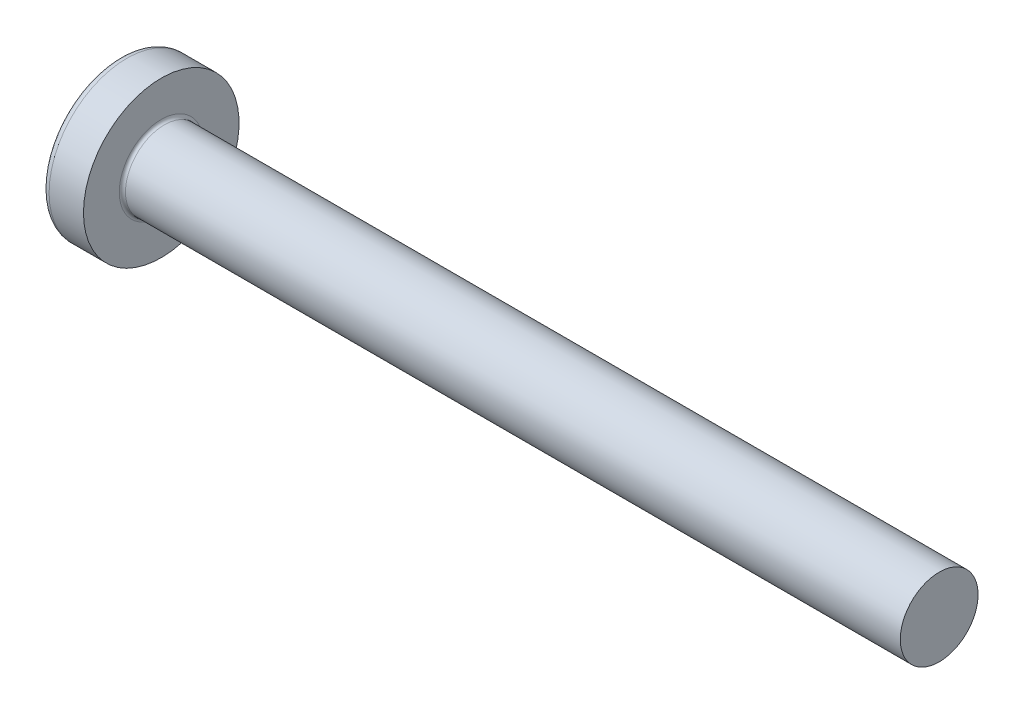
ISO-10303-21;
HEADER;
FILE_DESCRIPTION(('STEP AP214'),'2;1');
FILE_NAME('part.step','',(''),(''),'','','');
FILE_SCHEMA(('AUTOMOTIVE_DESIGN { 1 0 10303 214 1 1 1 1 }'));
ENDSEC;
DATA;
#1=APPLICATION_CONTEXT('core data for automotive mechanical design processes');
#2=APPLICATION_PROTOCOL_DEFINITION('international standard','automotive_design',2000,#1);
#3=PRODUCT_CONTEXT('',#1,'mechanical');
#4=PRODUCT('Part','Part','',(#3));
#5=PRODUCT_RELATED_PRODUCT_CATEGORY('part','',(#4));
#6=PRODUCT_DEFINITION_FORMATION('','',#4);
#7=PRODUCT_DEFINITION_CONTEXT('part definition',#1,'design');
#8=PRODUCT_DEFINITION('design','',#6,#7);
#9=PRODUCT_DEFINITION_SHAPE('','',#8);
#10=(LENGTH_UNIT() NAMED_UNIT(*) SI_UNIT(.MILLI.,.METRE.));
#11=(NAMED_UNIT(*) PLANE_ANGLE_UNIT() SI_UNIT($,.RADIAN.));
#12=(NAMED_UNIT(*) SI_UNIT($,.STERADIAN.) SOLID_ANGLE_UNIT());
#13=UNCERTAINTY_MEASURE_WITH_UNIT(LENGTH_MEASURE(1.E-05),#10,'distance_accuracy_value','');
#14=(GEOMETRIC_REPRESENTATION_CONTEXT(3) GLOBAL_UNCERTAINTY_ASSIGNED_CONTEXT((#13)) GLOBAL_UNIT_ASSIGNED_CONTEXT((#10,
#11,#12)) REPRESENTATION_CONTEXT('',''));
#15=CARTESIAN_POINT('',(0.,0.,0.));
#16=DIRECTION('',(0.,0.,1.));
#17=DIRECTION('',(1.,0.,0.));
#18=AXIS2_PLACEMENT_3D('',#15,#16,#17);
#19=CARTESIAN_POINT('',(4.,0.,0.));
#20=DIRECTION('',(-1.,0.,0.));
#21=DIRECTION('',(0.,1.,0.));
#22=AXIS2_PLACEMENT_3D('',#19,#20,#21);
#23=SPHERICAL_SURFACE('',#22,4.);
#24=CARTESIAN_POINT('',(0.803195914613468,0.,0.));
#25=DIRECTION('',(-1.,0.,0.));
#26=DIRECTION('',(0.,0.,1.));
#27=AXIS2_PLACEMENT_3D('',#24,#25,#26);
#28=CIRCLE('',#27,2.40425531914894);
#29=CARTESIAN_POINT('',(0.803195914613468,0.,2.40425531914894));
#30=VERTEX_POINT('',#29);
#31=EDGE_CURVE('E236',#30,#30,#28,.T.);
#32=ORIENTED_EDGE('',*,*,#31,.T.);
#33=EDGE_LOOP('',(#32));
#34=FACE_BOUND('',#33,.T.);
#35=CARTESIAN_POINT('',(0.0543400780062932,0.,0.));
#36=DIRECTION('',(1.,0.,0.));
#37=DIRECTION('',(0.,0.,-1.));
#38=AXIS2_PLACEMENT_3D('',#35,#36,#37);
#39=CIRCLE('',#38,0.657090389499513);
#40=CARTESIAN_POINT('',(0.0543400780062951,-0.369999999999997,-0.54301729251712));
#41=VERTEX_POINT('',#40);
#42=CARTESIAN_POINT('',(0.0543400780062932,-0.543017292517118,-0.37));
#43=VERTEX_POINT('',#42);
#44=EDGE_CURVE('E372',#41,#43,#39,.F.);
#45=ORIENTED_EDGE('',*,*,#44,.F.);
#46=CARTESIAN_POINT('',(4.,-0.37,0.));
#47=DIRECTION('',(0.,1.,0.));
#48=DIRECTION('',(0.,0.,1.));
#49=AXIS2_PLACEMENT_3D('',#46,#47,#48);
#50=CIRCLE('',#49,3.98285073785097);
#51=CARTESIAN_POINT('',(0.201999107564767,-0.369999999999995,-1.19928696360011));
#52=VERTEX_POINT('',#51);
#53=EDGE_CURVE('E298',#52,#41,#50,.T.);
#54=ORIENTED_EDGE('',*,*,#53,.F.);
#55=CARTESIAN_POINT('',(3.72274316107109,0.,0.55609120757213));
#56=DIRECTION('',(0.446197800778958,0.,-0.89493436774996));
#57=DIRECTION('',(-0.89493436774996,0.,-0.446197800778958));
#58=AXIS2_PLACEMENT_3D('',#55,#56,#57);
#59=CIRCLE('',#58,3.95144166275147);
#60=CARTESIAN_POINT('',(0.201999107564769,0.370000000000004,-1.19928696360011));
#61=VERTEX_POINT('',#60);
#62=EDGE_CURVE('E270',#52,#61,#59,.T.);
#63=ORIENTED_EDGE('',*,*,#62,.T.);
#64=CARTESIAN_POINT('',(4.,0.37,0.));
#65=DIRECTION('',(0.,-1.,0.));
#66=DIRECTION('',(0.,0.,-1.));
#67=AXIS2_PLACEMENT_3D('',#64,#65,#66);
#68=CIRCLE('',#67,3.98285073785097);
#69=CARTESIAN_POINT('',(0.0543400780062952,0.370000000000002,-0.543017292517118));
#70=VERTEX_POINT('',#69);
#71=EDGE_CURVE('E325',#70,#61,#68,.T.);
#72=ORIENTED_EDGE('',*,*,#71,.F.);
#73=CARTESIAN_POINT('',(0.0543400780062932,0.543017292517108,-0.37));
#74=VERTEX_POINT('',#73);
#75=EDGE_CURVE('E391',#74,#70,#39,.F.);
#76=ORIENTED_EDGE('',*,*,#75,.F.);
#77=CARTESIAN_POINT('',(4.,0.,-0.37));
#78=DIRECTION('',(0.,0.,1.));
#79=DIRECTION('',(0.,-1.,0.));
#80=AXIS2_PLACEMENT_3D('',#77,#78,#79);
#81=CIRCLE('',#80,3.98285073785097);
#82=CARTESIAN_POINT('',(0.201999107564769,1.19928696360011,-0.37));
#83=VERTEX_POINT('',#82);
#84=EDGE_CURVE('E264',#83,#74,#81,.T.);
#85=ORIENTED_EDGE('',*,*,#84,.F.);
#86=CARTESIAN_POINT('',(3.72274316107109,-0.556091207572132,0.));
#87=DIRECTION('',(0.446197800778958,0.89493436774996,0.));
#88=DIRECTION('',(-0.89493436774996,0.446197800778958,0.));
#89=AXIS2_PLACEMENT_3D('',#86,#87,#88);
#90=CIRCLE('',#89,3.95144166275147);
#91=CARTESIAN_POINT('',(0.201999107564769,1.19928696360011,0.369999999999999));
#92=VERTEX_POINT('',#91);
#93=EDGE_CURVE('E267',#83,#92,#90,.T.);
#94=ORIENTED_EDGE('',*,*,#93,.T.);
#95=CARTESIAN_POINT('',(4.,0.,0.37));
#96=DIRECTION('',(0.,0.,-1.));
#97=DIRECTION('',(0.,1.,0.));
#98=AXIS2_PLACEMENT_3D('',#95,#96,#97);
#99=CIRCLE('',#98,3.98285073785097);
#100=CARTESIAN_POINT('',(0.0543400780062932,0.543017292517108,0.37));
#101=VERTEX_POINT('',#100);
#102=EDGE_CURVE('E260',#101,#92,#99,.T.);
#103=ORIENTED_EDGE('',*,*,#102,.F.);
#104=CARTESIAN_POINT('',(0.0543400780062959,0.369999999999998,0.54301729251712));
#105=VERTEX_POINT('',#104);
#106=EDGE_CURVE('E390',#105,#101,#39,.F.);
#107=ORIENTED_EDGE('',*,*,#106,.F.);
#108=CARTESIAN_POINT('',(0.201999107564769,0.369999999999996,1.19928696360011));
#109=VERTEX_POINT('',#108);
#110=EDGE_CURVE('E280',#109,#105,#68,.T.);
#111=ORIENTED_EDGE('',*,*,#110,.F.);
#112=CARTESIAN_POINT('',(3.72274316107109,0.,-0.556091207572131));
#113=DIRECTION('',(0.446197800778958,0.,0.89493436774996));
#114=DIRECTION('',(0.89493436774996,0.,-0.446197800778958));
#115=AXIS2_PLACEMENT_3D('',#112,#113,#114);
#116=CIRCLE('',#115,3.95144166275147);
#117=CARTESIAN_POINT('',(0.201999107564767,-0.370000000000003,1.19928696360011));
#118=VERTEX_POINT('',#117);
#119=EDGE_CURVE('E47',#109,#118,#116,.T.);
#120=ORIENTED_EDGE('',*,*,#119,.T.);
#121=CARTESIAN_POINT('',(0.0543400780062943,-0.370000000000002,0.543017292517118));
#122=VERTEX_POINT('',#121);
#123=EDGE_CURVE('E277',#122,#118,#50,.T.);
#124=ORIENTED_EDGE('',*,*,#123,.F.);
#125=CARTESIAN_POINT('',(0.0543400780062932,-0.543017292517119,0.369999999999999));
#126=VERTEX_POINT('',#125);
#127=EDGE_CURVE('E426',#126,#122,#39,.F.);
#128=ORIENTED_EDGE('',*,*,#127,.F.);
#129=CARTESIAN_POINT('',(0.201999107564767,-1.19928696360011,0.369999999999999));
#130=VERTEX_POINT('',#129);
#131=EDGE_CURVE('E261',#130,#126,#99,.T.);
#132=ORIENTED_EDGE('',*,*,#131,.F.);
#133=CARTESIAN_POINT('',(3.72274316107108,0.556091207572129,0.));
#134=DIRECTION('',(0.446197800778958,-0.89493436774996,0.));
#135=DIRECTION('',(0.89493436774996,0.446197800778958,0.));
#136=AXIS2_PLACEMENT_3D('',#133,#134,#135);
#137=CIRCLE('',#136,3.95144166275147);
#138=CARTESIAN_POINT('',(0.201999107564767,-1.19928696360011,-0.37));
#139=VERTEX_POINT('',#138);
#140=EDGE_CURVE('E257',#130,#139,#137,.T.);
#141=ORIENTED_EDGE('',*,*,#140,.T.);
#142=EDGE_CURVE('E62',#43,#139,#81,.T.);
#143=ORIENTED_EDGE('',*,*,#142,.F.);
#144=EDGE_LOOP('',(#45,#54,#63,#72,#76,#85,#94,#103,#107,#111,#120,#124,#128,#132,#141,#143));
#145=FACE_BOUND('',#144,.T.);
#146=ADVANCED_FACE('F34',(#34,#145),#23,.T.);
#147=CARTESIAN_POINT('',(1.5,0.552127613725262,-0.37));
#148=DIRECTION('',(0.,0.,1.));
#149=DIRECTION('',(0.,-1.,0.));
#150=AXIS2_PLACEMENT_3D('',#147,#148,#149);
#151=PLANE('',#150);
#152=ORIENTED_EDGE('',*,*,#84,.T.);
#153=CARTESIAN_POINT('',(-0.984107487670367,0.628943903400079,-0.37));
#154=CARTESIAN_POINT('',(-0.783603343010497,0.61266994729586,-0.37));
#155=CARTESIAN_POINT('',(-0.583110931105435,0.596248129681252,-0.37));
#156=CARTESIAN_POINT('',(-0.18215578845311,0.562989164841799,-0.37));
#157=CARTESIAN_POINT('',(0.0183069414727265,0.546152007726099,-0.37));
#158=CARTESIAN_POINT('',(0.419186928470242,0.511943523152269,-0.37));
#159=CARTESIAN_POINT('',(0.619604185545593,0.494572195737286,-0.37));
#160=CARTESIAN_POINT('',(1.02037173794803,0.459102589125813,-0.37));
#161=CARTESIAN_POINT('',(1.2207220342401,0.441004320904832,-0.37));
#162=CARTESIAN_POINT('',(1.53631168775438,0.411665443099097,-0.37));
#163=CARTESIAN_POINT('',(1.65158348734389,0.400774467003668,-0.37));
#164=CARTESIAN_POINT('',(1.88208360561995,0.378547148307843,-0.37));
#165=CARTESIAN_POINT('',(1.99731192453001,0.367210808029148,-0.37));
#166=CARTESIAN_POINT('',(2.22771614129417,0.343963614894539,-0.37));
#167=CARTESIAN_POINT('',(2.34289203669258,0.332052737461204,-0.37));
#168=CARTESIAN_POINT('',(2.57315819348689,0.307413208767174,-0.37));
#169=CARTESIAN_POINT('',(2.68824845325201,0.294684542317003,-0.37));
#170=CARTESIAN_POINT('',(2.80327961663977,0.281425340988347,-0.37));
#171=B_SPLINE_CURVE_WITH_KNOTS('',3,(#153,#154,#155,#156,#157,#158,#159,#160,#161,#162,#163,
#164,#165,#166,#167,#168,#169,#170),.UNSPECIFIED.,.F.,.F.,(4,2,2,2,2,2,2,2,4),(0.,
0.603490856265592,1.20699609790448,1.81050129079485,2.41399737525605,2.76135214324501,
3.1087051006998,3.45607293034176,3.80344721380205),.UNSPECIFIED.);
#172=CARTESIAN_POINT('',(1.5,0.415013252800437,-0.370000000000001));
#173=VERTEX_POINT('',#172);
#174=EDGE_CURVE('E412',#74,#173,#171,.T.);
#175=ORIENTED_EDGE('',*,*,#174,.T.);
#176=DIRECTION('',(0.,1.,0.));
#177=VECTOR('',#176,1.);
#178=CARTESIAN_POINT('',(1.5,-0.552127613725262,-0.37));
#179=LINE('',#178,#177);
#180=CARTESIAN_POINT('',(1.5,0.552127613725262,-0.37));
#181=VERTEX_POINT('',#180);
#182=EDGE_CURVE('E354',#173,#181,#179,.T.);
#183=ORIENTED_EDGE('',*,*,#182,.T.);
#184=DIRECTION('',(0.89493436774996,-0.446197800778958,0.));
#185=VECTOR('',#184,1.);
#186=CARTESIAN_POINT('',(0.,1.3,-0.37));
#187=LINE('',#186,#185);
#188=EDGE_CURVE('E237',#83,#181,#187,.T.);
#189=ORIENTED_EDGE('',*,*,#188,.F.);
#190=EDGE_LOOP('',(#152,#175,#183,#189));
#191=FACE_BOUND('',#190,.T.);
#192=ADVANCED_FACE('F192',(#191),#151,.T.);
#193=CARTESIAN_POINT('',(1.5,-0.552127613725262,-0.37));
#194=VERTEX_POINT('',#193);
#195=CARTESIAN_POINT('',(1.5,-0.415013252800437,-0.370000000000001));
#196=VERTEX_POINT('',#195);
#197=EDGE_CURVE('E245',#194,#196,#179,.T.);
#198=ORIENTED_EDGE('',*,*,#197,.T.);
#199=CARTESIAN_POINT('',(-0.984107487670368,-0.62894390340008,-0.37));
#200=CARTESIAN_POINT('',(-0.783603343010498,-0.61266994729586,-0.37));
#201=CARTESIAN_POINT('',(-0.583110931105436,-0.596248129681252,-0.37));
#202=CARTESIAN_POINT('',(-0.18215578845311,-0.562989164841799,-0.37));
#203=CARTESIAN_POINT('',(0.0183069414727262,-0.546152007726099,-0.37));
#204=CARTESIAN_POINT('',(0.419186928470242,-0.511943523152269,-0.37));
#205=CARTESIAN_POINT('',(0.619604185545593,-0.494572195737286,-0.37));
#206=CARTESIAN_POINT('',(1.02037173794803,-0.459102589125813,-0.37));
#207=CARTESIAN_POINT('',(1.22072203424009,-0.441004320904833,-0.37));
#208=CARTESIAN_POINT('',(1.53631168775438,-0.411665443099097,-0.37));
#209=CARTESIAN_POINT('',(1.65158348734389,-0.400774467003668,-0.37));
#210=CARTESIAN_POINT('',(1.88208360561995,-0.378547148307843,-0.37));
#211=CARTESIAN_POINT('',(1.99731192453001,-0.367210808029148,-0.37));
#212=CARTESIAN_POINT('',(2.22771614129417,-0.343963614894539,-0.37));
#213=CARTESIAN_POINT('',(2.34289203669258,-0.332052737461204,-0.37));
#214=CARTESIAN_POINT('',(2.57315819348689,-0.307413208767175,-0.37));
#215=CARTESIAN_POINT('',(2.68824845325202,-0.294684542317003,-0.37));
#216=CARTESIAN_POINT('',(2.80327961663977,-0.281425340988347,-0.37));
#217=B_SPLINE_CURVE_WITH_KNOTS('',3,(#199,#200,#201,#202,#203,#204,#205,#206,#207,#208,#209,
#210,#211,#212,#213,#214,#215,#216),.UNSPECIFIED.,.F.,.F.,(4,2,2,2,2,2,2,2,4),(0.,
0.603490856265593,1.20699609790448,1.81050129079485,2.41399737525605,2.76135214324501,
3.1087051006998,3.45607293034176,3.80344721380205),.UNSPECIFIED.);
#218=EDGE_CURVE('E389',#196,#43,#217,.F.);
#219=ORIENTED_EDGE('',*,*,#218,.T.);
#220=ORIENTED_EDGE('',*,*,#142,.T.);
#221=DIRECTION('',(0.89493436774996,0.446197800778958,0.));
#222=VECTOR('',#221,1.);
#223=CARTESIAN_POINT('',(0.,-1.3,-0.37));
#224=LINE('',#223,#222);
#225=EDGE_CURVE('E328',#139,#194,#224,.T.);
#226=ORIENTED_EDGE('',*,*,#225,.T.);
#227=EDGE_LOOP('',(#198,#219,#220,#226));
#228=FACE_BOUND('',#227,.T.);
#229=ADVANCED_FACE('F198',(#228),#151,.T.);
#230=CARTESIAN_POINT('',(1.5,-0.552127613725262,0.369999999999999));
#231=DIRECTION('',(0.,0.,-1.));
#232=DIRECTION('',(0.,1.,0.));
#233=AXIS2_PLACEMENT_3D('',#230,#231,#232);
#234=PLANE('',#233);
#235=DIRECTION('',(0.,-1.,0.));
#236=VECTOR('',#235,1.);
#237=CARTESIAN_POINT('',(1.5,0.552127613725262,0.37));
#238=LINE('',#237,#236);
#239=CARTESIAN_POINT('',(1.5,0.552127613725262,0.37));
#240=VERTEX_POINT('',#239);
#241=CARTESIAN_POINT('',(1.5,0.415013252800437,0.370000000000001));
#242=VERTEX_POINT('',#241);
#243=EDGE_CURVE('E337',#240,#242,#238,.T.);
#244=ORIENTED_EDGE('',*,*,#243,.T.);
#245=CARTESIAN_POINT('',(-0.984107487670367,0.62894390340008,0.37));
#246=CARTESIAN_POINT('',(-0.783603343010497,0.61266994729586,0.37));
#247=CARTESIAN_POINT('',(-0.583110931105435,0.596248129681252,0.37));
#248=CARTESIAN_POINT('',(-0.182155788453109,0.562989164841799,0.37));
#249=CARTESIAN_POINT('',(0.0183069414727271,0.546152007726099,0.37));
#250=CARTESIAN_POINT('',(0.419186928470243,0.511943523152269,0.37));
#251=CARTESIAN_POINT('',(0.619604185545594,0.494572195737286,0.37));
#252=CARTESIAN_POINT('',(1.02037173794803,0.459102589125813,0.37));
#253=CARTESIAN_POINT('',(1.2207220342401,0.441004320904832,0.37));
#254=CARTESIAN_POINT('',(1.53631168775438,0.411665443099097,0.37));
#255=CARTESIAN_POINT('',(1.65158348734389,0.400774467003668,0.37));
#256=CARTESIAN_POINT('',(1.88208360561995,0.378547148307843,0.37));
#257=CARTESIAN_POINT('',(1.99731192453001,0.367210808029148,0.37));
#258=CARTESIAN_POINT('',(2.22771614129417,0.343963614894539,0.37));
#259=CARTESIAN_POINT('',(2.34289203669258,0.332052737461205,0.37));
#260=CARTESIAN_POINT('',(2.57315819348689,0.307413208767175,0.37));
#261=CARTESIAN_POINT('',(2.68824845325201,0.294684542317003,0.37));
#262=CARTESIAN_POINT('',(2.80327961663977,0.281425340988347,0.37));
#263=B_SPLINE_CURVE_WITH_KNOTS('',3,(#245,#246,#247,#248,#249,#250,#251,#252,#253,#254,#255,
#256,#257,#258,#259,#260,#261,#262),.UNSPECIFIED.,.F.,.F.,(4,2,2,2,2,2,2,2,4),(0.,
0.603490856265592,1.20699609790448,1.81050129079485,2.41399737525605,2.76135214324501,
3.1087051006998,3.45607293034176,3.80344721380205),.UNSPECIFIED.);
#264=EDGE_CURVE('E664',#242,#101,#263,.F.);
#265=ORIENTED_EDGE('',*,*,#264,.T.);
#266=ORIENTED_EDGE('',*,*,#102,.T.);
#267=DIRECTION('',(0.89493436774996,-0.446197800778958,0.));
#268=VECTOR('',#267,1.);
#269=CARTESIAN_POINT('',(0.,1.3,0.37));
#270=LINE('',#269,#268);
#271=EDGE_CURVE('E242',#92,#240,#270,.T.);
#272=ORIENTED_EDGE('',*,*,#271,.T.);
#273=EDGE_LOOP('',(#244,#265,#266,#272));
#274=FACE_BOUND('',#273,.T.);
#275=ADVANCED_FACE('F408',(#274),#234,.T.);
#276=ORIENTED_EDGE('',*,*,#131,.T.);
#277=CARTESIAN_POINT('',(-0.984107487670368,-0.62894390340008,0.369999999999999));
#278=CARTESIAN_POINT('',(-0.783603343010498,-0.612669947295861,0.369999999999999));
#279=CARTESIAN_POINT('',(-0.583110931105436,-0.596248129681252,0.369999999999999));
#280=CARTESIAN_POINT('',(-0.18215578845311,-0.562989164841799,0.369999999999999));
#281=CARTESIAN_POINT('',(0.0183069414727261,-0.5461520077261,0.369999999999999));
#282=CARTESIAN_POINT('',(0.419186928470242,-0.511943523152269,0.369999999999999));
#283=CARTESIAN_POINT('',(0.619604185545593,-0.494572195737287,0.369999999999999));
#284=CARTESIAN_POINT('',(1.02037173794803,-0.459102589125814,0.369999999999999));
#285=CARTESIAN_POINT('',(1.22072203424009,-0.441004320904833,0.369999999999999));
#286=CARTESIAN_POINT('',(1.53631168775438,-0.411665443099098,0.369999999999999));
#287=CARTESIAN_POINT('',(1.65158348734389,-0.400774467003669,0.37));
#288=CARTESIAN_POINT('',(1.88208360561995,-0.378547148307843,0.37));
#289=CARTESIAN_POINT('',(1.99731192453001,-0.367210808029148,0.37));
#290=CARTESIAN_POINT('',(2.22771614129417,-0.34396361489454,0.37));
#291=CARTESIAN_POINT('',(2.34289203669258,-0.332052737461205,0.37));
#292=CARTESIAN_POINT('',(2.57315819348689,-0.307413208767175,0.37));
#293=CARTESIAN_POINT('',(2.68824845325201,-0.294684542317003,0.37));
#294=CARTESIAN_POINT('',(2.80327961663977,-0.281425340988347,0.37));
#295=B_SPLINE_CURVE_WITH_KNOTS('',3,(#277,#278,#279,#280,#281,#282,#283,#284,#285,#286,#287,
#288,#289,#290,#291,#292,#293,#294),.UNSPECIFIED.,.F.,.F.,(4,2,2,2,2,2,2,2,4),(0.,
0.603490856265592,1.20699609790448,1.81050129079485,2.41399737525605,2.76135214324501,
3.1087051006998,3.45607293034176,3.80344721380205),.UNSPECIFIED.);
#296=CARTESIAN_POINT('',(1.5,-0.415013252800438,0.37));
#297=VERTEX_POINT('',#296);
#298=EDGE_CURVE('E427',#126,#297,#295,.T.);
#299=ORIENTED_EDGE('',*,*,#298,.T.);
#300=CARTESIAN_POINT('',(1.5,-0.552127613725262,0.369999999999999));
#301=VERTEX_POINT('',#300);
#302=EDGE_CURVE('E339',#297,#301,#238,.T.);
#303=ORIENTED_EDGE('',*,*,#302,.T.);
#304=DIRECTION('',(0.89493436774996,0.446197800778958,0.));
#305=VECTOR('',#304,1.);
#306=CARTESIAN_POINT('',(0.,-1.3,0.369999999999999));
#307=LINE('',#306,#305);
#308=EDGE_CURVE('E330',#130,#301,#307,.T.);
#309=ORIENTED_EDGE('',*,*,#308,.F.);
#310=EDGE_LOOP('',(#276,#299,#303,#309));
#311=FACE_BOUND('',#310,.T.);
#312=ADVANCED_FACE('F518',(#311),#234,.T.);
#313=CARTESIAN_POINT('',(1.5,0.552127613725262,0.37));
#314=DIRECTION('',(0.446197800778958,0.89493436774996,0.));
#315=DIRECTION('',(-0.89493436774996,0.446197800778958,0.));
#316=AXIS2_PLACEMENT_3D('',#313,#314,#315);
#317=PLANE('',#316);
#318=CARTESIAN_POINT('',(2.47007520981164,0.0684659723733949,0.));
#319=DIRECTION('',(0.446197800778958,0.89493436774996,0.));
#320=DIRECTION('',(-0.89493436774996,0.446197800778958,0.));
#321=AXIS2_PLACEMENT_3D('',#318,#319,#320);
#322=ELLIPSE('',#321,1.09405678911959,0.483340660124242);
#323=CARTESIAN_POINT('',(1.5,0.552127613725263,0.0655064741994778));
#324=VERTEX_POINT('',#323);
#325=CARTESIAN_POINT('',(1.5,0.552127613725263,-0.0655064741994778));
#326=VERTEX_POINT('',#325);
#327=EDGE_CURVE('E303',#324,#326,#322,.F.);
#328=ORIENTED_EDGE('',*,*,#327,.F.);
#329=DIRECTION('',(0.,0.,-1.));
#330=VECTOR('',#329,1.);
#331=CARTESIAN_POINT('',(1.5,0.552127613725262,0.37));
#332=LINE('',#331,#330);
#333=EDGE_CURVE('E340',#240,#324,#332,.T.);
#334=ORIENTED_EDGE('',*,*,#333,.F.);
#335=ORIENTED_EDGE('',*,*,#271,.F.);
#336=ORIENTED_EDGE('',*,*,#93,.F.);
#337=ORIENTED_EDGE('',*,*,#188,.T.);
#338=EDGE_CURVE('E342',#326,#181,#332,.T.);
#339=ORIENTED_EDGE('',*,*,#338,.F.);
#340=EDGE_LOOP('',(#328,#334,#335,#336,#337,#339));
#341=FACE_BOUND('',#340,.T.);
#342=ADVANCED_FACE('F406',(#341),#317,.F.);
#343=CARTESIAN_POINT('',(1.5,-0.552127613725262,-0.37));
#344=DIRECTION('',(0.446197800778958,-0.89493436774996,0.));
#345=DIRECTION('',(0.89493436774996,0.446197800778958,0.));
#346=AXIS2_PLACEMENT_3D('',#343,#344,#345);
#347=PLANE('',#346);
#348=CARTESIAN_POINT('',(2.47007520981164,-0.0684659723733946,0.));
#349=DIRECTION('',(0.446197800778958,-0.89493436774996,0.));
#350=DIRECTION('',(-0.89493436774996,-0.446197800778958,0.));
#351=AXIS2_PLACEMENT_3D('',#348,#349,#350);
#352=ELLIPSE('',#351,1.09405678911959,0.483340660124242);
#353=CARTESIAN_POINT('',(1.5,-0.552127613725263,-0.0655064741994742));
#354=VERTEX_POINT('',#353);
#355=CARTESIAN_POINT('',(1.5,-0.552127613725263,0.0655064741994742));
#356=VERTEX_POINT('',#355);
#357=EDGE_CURVE('E666',#354,#356,#352,.F.);
#358=ORIENTED_EDGE('',*,*,#357,.F.);
#359=DIRECTION('',(0.,0.,1.));
#360=VECTOR('',#359,1.);
#361=CARTESIAN_POINT('',(1.5,-0.552127613725262,-0.37));
#362=LINE('',#361,#360);
#363=EDGE_CURVE('E333',#194,#354,#362,.T.);
#364=ORIENTED_EDGE('',*,*,#363,.F.);
#365=ORIENTED_EDGE('',*,*,#225,.F.);
#366=ORIENTED_EDGE('',*,*,#140,.F.);
#367=ORIENTED_EDGE('',*,*,#308,.T.);
#368=EDGE_CURVE('E336',#356,#301,#362,.T.);
#369=ORIENTED_EDGE('',*,*,#368,.F.);
#370=EDGE_LOOP('',(#358,#364,#365,#366,#367,#369));
#371=FACE_BOUND('',#370,.T.);
#372=ADVANCED_FACE('F505',(#371),#347,.F.);
#373=CARTESIAN_POINT('',(1.5,0.552127613725262,-0.37));
#374=DIRECTION('',(-1.,0.,0.));
#375=DIRECTION('',(0.,0.,1.));
#376=AXIS2_PLACEMENT_3D('',#373,#374,#375);
#377=PLANE('',#376);
#378=DIRECTION('',(0.,1.,0.));
#379=VECTOR('',#378,1.);
#380=CARTESIAN_POINT('',(1.5,-0.370000000000002,0.552127613725261));
#381=LINE('',#380,#379);
#382=CARTESIAN_POINT('',(1.5,-0.370000000000002,0.552127613725261));
#383=VERTEX_POINT('',#382);
#384=CARTESIAN_POINT('',(1.5,-0.0655064741994869,0.552127613725262));
#385=VERTEX_POINT('',#384);
#386=EDGE_CURVE('E318',#383,#385,#381,.T.);
#387=ORIENTED_EDGE('',*,*,#386,.T.);
#388=CARTESIAN_POINT('',(1.5,0.,0.));
#389=DIRECTION('',(-1.,0.,0.));
#390=DIRECTION('',(0.,0.,1.));
#391=AXIS2_PLACEMENT_3D('',#388,#389,#390);
#392=CIRCLE('',#391,0.556);
#393=CARTESIAN_POINT('',(1.5,-0.370000000000001,0.415013252800437));
#394=VERTEX_POINT('',#393);
#395=EDGE_CURVE('E692',#394,#385,#392,.T.);
#396=ORIENTED_EDGE('',*,*,#395,.F.);
#397=DIRECTION('',(0.,0.,-1.));
#398=VECTOR('',#397,1.);
#399=CARTESIAN_POINT('',(1.5,-0.370000000000002,0.552127613725261));
#400=LINE('',#399,#398);
#401=EDGE_CURVE('E314',#383,#394,#400,.T.);
#402=ORIENTED_EDGE('',*,*,#401,.F.);
#403=EDGE_LOOP('',(#387,#396,#402));
#404=FACE_BOUND('',#403,.T.);
#405=ADVANCED_FACE('F462',(#404),#377,.T.);
#406=ORIENTED_EDGE('',*,*,#302,.F.);
#407=EDGE_CURVE('E697',#356,#297,#392,.T.);
#408=ORIENTED_EDGE('',*,*,#407,.F.);
#409=ORIENTED_EDGE('',*,*,#368,.T.);
#410=EDGE_LOOP('',(#406,#408,#409));
#411=FACE_BOUND('',#410,.T.);
#412=ADVANCED_FACE('F492',(#411),#377,.T.);
#413=ORIENTED_EDGE('',*,*,#363,.T.);
#414=EDGE_CURVE('E383',#196,#354,#392,.T.);
#415=ORIENTED_EDGE('',*,*,#414,.F.);
#416=ORIENTED_EDGE('',*,*,#197,.F.);
#417=EDGE_LOOP('',(#413,#415,#416));
#418=FACE_BOUND('',#417,.T.);
#419=ADVANCED_FACE('F486',(#418),#377,.T.);
#420=CARTESIAN_POINT('',(1.5,-0.369999999999998,-0.415013252800438));
#421=VERTEX_POINT('',#420);
#422=CARTESIAN_POINT('',(1.5,-0.369999999999997,-0.552127613725264));
#423=VERTEX_POINT('',#422);
#424=EDGE_CURVE('E317',#421,#423,#400,.T.);
#425=ORIENTED_EDGE('',*,*,#424,.F.);
#426=CARTESIAN_POINT('',(1.5,-0.0655064741994786,-0.552127613725263));
#427=VERTEX_POINT('',#426);
#428=EDGE_CURVE('E54',#427,#421,#392,.T.);
#429=ORIENTED_EDGE('',*,*,#428,.F.);
#430=DIRECTION('',(0.,-1.,0.));
#431=VECTOR('',#430,1.);
#432=CARTESIAN_POINT('',(1.5,0.370000000000002,-0.552127613725261));
#433=LINE('',#432,#431);
#434=EDGE_CURVE('E313',#427,#423,#433,.T.);
#435=ORIENTED_EDGE('',*,*,#434,.T.);
#436=EDGE_LOOP('',(#425,#429,#435));
#437=FACE_BOUND('',#436,.T.);
#438=ADVANCED_FACE('F378',(#437),#377,.T.);
#439=CARTESIAN_POINT('',(1.5,0.370000000000002,-0.552127613725261));
#440=VERTEX_POINT('',#439);
#441=CARTESIAN_POINT('',(1.5,0.0655064741994824,-0.552127613725262));
#442=VERTEX_POINT('',#441);
#443=EDGE_CURVE('E310',#440,#442,#433,.T.);
#444=ORIENTED_EDGE('',*,*,#443,.T.);
#445=CARTESIAN_POINT('',(1.5,0.370000000000001,-0.415013252800437));
#446=VERTEX_POINT('',#445);
#447=EDGE_CURVE('E382',#446,#442,#392,.T.);
#448=ORIENTED_EDGE('',*,*,#447,.F.);
#449=DIRECTION('',(0.,0.,1.));
#450=VECTOR('',#449,1.);
#451=CARTESIAN_POINT('',(1.5,0.370000000000002,-0.552127613725261));
#452=LINE('',#451,#450);
#453=EDGE_CURVE('E322',#440,#446,#452,.T.);
#454=ORIENTED_EDGE('',*,*,#453,.F.);
#455=EDGE_LOOP('',(#444,#448,#454));
#456=FACE_BOUND('',#455,.T.);
#457=ADVANCED_FACE('F474',(#456),#377,.T.);
#458=ORIENTED_EDGE('',*,*,#182,.F.);
#459=EDGE_CURVE('E681',#326,#173,#392,.T.);
#460=ORIENTED_EDGE('',*,*,#459,.F.);
#461=ORIENTED_EDGE('',*,*,#338,.T.);
#462=EDGE_LOOP('',(#458,#460,#461));
#463=FACE_BOUND('',#462,.T.);
#464=ADVANCED_FACE('F468',(#463),#377,.T.);
#465=ORIENTED_EDGE('',*,*,#333,.T.);
#466=EDGE_CURVE('E683',#242,#324,#392,.T.);
#467=ORIENTED_EDGE('',*,*,#466,.F.);
#468=ORIENTED_EDGE('',*,*,#243,.F.);
#469=EDGE_LOOP('',(#465,#467,#468));
#470=FACE_BOUND('',#469,.T.);
#471=ADVANCED_FACE('F460',(#470),#377,.T.);
#472=CARTESIAN_POINT('',(1.5,0.369999999999999,0.415013252800439));
#473=VERTEX_POINT('',#472);
#474=CARTESIAN_POINT('',(1.5,0.369999999999998,0.552127613725263));
#475=VERTEX_POINT('',#474);
#476=EDGE_CURVE('E295',#473,#475,#452,.T.);
#477=ORIENTED_EDGE('',*,*,#476,.F.);
#478=CARTESIAN_POINT('',(1.5,0.065506474199483,0.552127613725262));
#479=VERTEX_POINT('',#478);
#480=EDGE_CURVE('E384',#479,#473,#392,.T.);
#481=ORIENTED_EDGE('',*,*,#480,.F.);
#482=EDGE_CURVE('E321',#479,#475,#381,.T.);
#483=ORIENTED_EDGE('',*,*,#482,.T.);
#484=EDGE_LOOP('',(#477,#481,#483));
#485=FACE_BOUND('',#484,.T.);
#486=ADVANCED_FACE('F454',(#485),#377,.T.);
#487=CARTESIAN_POINT('',(1.5,0.369999999999998,0.552127613725263));
#488=DIRECTION('',(0.,-1.,0.));
#489=DIRECTION('',(0.,0.,-1.));
#490=AXIS2_PLACEMENT_3D('',#487,#488,#489);
#491=PLANE('',#490);
#492=ORIENTED_EDGE('',*,*,#110,.T.);
#493=CARTESIAN_POINT('',(-0.984107487668669,0.369999999999998,0.628943903399943));
#494=CARTESIAN_POINT('',(-0.783603343008974,0.369999999999998,0.612669947295737));
#495=CARTESIAN_POINT('',(-0.583110931104086,0.369999999999998,0.596248129681142));
#496=CARTESIAN_POINT('',(-0.182155788452108,0.369999999999998,0.562989164841716));
#497=CARTESIAN_POINT('',(0.0183069414735535,0.369999999999998,0.546152007726031));
#498=CARTESIAN_POINT('',(0.419186928470486,0.369999999999998,0.511943523152249));
#499=CARTESIAN_POINT('',(0.61960418554543,0.369999999999998,0.494572195737301));
#500=CARTESIAN_POINT('',(1.02037173794706,0.369999999999998,0.459102589125902));
#501=CARTESIAN_POINT('',(1.22072203423871,0.369999999999999,0.441004320904959));
#502=CARTESIAN_POINT('',(1.53631168775258,0.369999999999999,0.411665443099267));
#503=CARTESIAN_POINT('',(1.65158348734209,0.369999999999999,0.40077446700384));
#504=CARTESIAN_POINT('',(1.88208360561816,0.369999999999999,0.378547148308019));
#505=CARTESIAN_POINT('',(1.99731192452822,0.369999999999999,0.367210808029327));
#506=CARTESIAN_POINT('',(2.22771614129237,0.369999999999999,0.343963614894724));
#507=CARTESIAN_POINT('',(2.34289203669079,0.369999999999999,0.332052737461393));
#508=CARTESIAN_POINT('',(2.5731581934851,0.369999999999999,0.307413208767371));
#509=CARTESIAN_POINT('',(2.68824845325022,0.369999999999999,0.294684542317205));
#510=CARTESIAN_POINT('',(2.80327961663798,0.369999999999999,0.281425340988555));
#511=B_SPLINE_CURVE_WITH_KNOTS('',3,(#493,#494,#495,#496,#497,#498,#499,#500,#501,#502,#503,
#504,#505,#506,#507,#508,#509,#510),.UNSPECIFIED.,.F.,.F.,(4,2,2,2,2,2,2,2,4),(0.,
0.603490856265068,1.20699609790343,1.81050129079257,2.41399737525255,2.7613521432415,
3.1087051006963,3.45607293033825,3.80344721379854),.UNSPECIFIED.);
#512=EDGE_CURVE('E663',#105,#473,#511,.T.);
#513=ORIENTED_EDGE('',*,*,#512,.T.);
#514=ORIENTED_EDGE('',*,*,#476,.T.);
#515=DIRECTION('',(0.89493436774996,0.,-0.446197800778958));
#516=VECTOR('',#515,1.);
#517=CARTESIAN_POINT('',(0.,0.369999999999996,1.3));
#518=LINE('',#517,#516);
#519=EDGE_CURVE('E288',#109,#475,#518,.T.);
#520=ORIENTED_EDGE('',*,*,#519,.F.);
#521=EDGE_LOOP('',(#492,#513,#514,#520));
#522=FACE_BOUND('',#521,.T.);
#523=ADVANCED_FACE('F292',(#522),#491,.T.);
#524=CARTESIAN_POINT('',(1.5,-0.369999999999997,-0.552127613725264));
#525=DIRECTION('',(0.,1.,0.));
#526=DIRECTION('',(0.,0.,1.));
#527=AXIS2_PLACEMENT_3D('',#524,#525,#526);
#528=PLANE('',#527);
#529=ORIENTED_EDGE('',*,*,#401,.T.);
#530=CARTESIAN_POINT('',(-0.984107487668671,-0.370000000000002,0.628943903399941));
#531=CARTESIAN_POINT('',(-0.783603343008975,-0.370000000000002,0.612669947295735));
#532=CARTESIAN_POINT('',(-0.583110931104087,-0.370000000000002,0.59624812968114));
#533=CARTESIAN_POINT('',(-0.18215578845211,-0.370000000000002,0.562989164841714));
#534=CARTESIAN_POINT('',(0.0183069414735518,-0.370000000000002,0.546152007726028));
#535=CARTESIAN_POINT('',(0.419186928470486,-0.370000000000001,0.511943523152246));
#536=CARTESIAN_POINT('',(0.619604185545429,-0.370000000000001,0.494572195737299));
#537=CARTESIAN_POINT('',(1.02037173794706,-0.370000000000001,0.459102589125899));
#538=CARTESIAN_POINT('',(1.22072203423871,-0.370000000000001,0.441004320904957));
#539=CARTESIAN_POINT('',(1.53631168775258,-0.370000000000001,0.411665443099265));
#540=CARTESIAN_POINT('',(1.65158348734209,-0.370000000000001,0.400774467003838));
#541=CARTESIAN_POINT('',(1.88208360561815,-0.370000000000001,0.378547148308017));
#542=CARTESIAN_POINT('',(1.99731192452821,-0.370000000000001,0.367210808029324));
#543=CARTESIAN_POINT('',(2.22771614129237,-0.370000000000001,0.343963614894722));
#544=CARTESIAN_POINT('',(2.34289203669079,-0.370000000000001,0.332052737461391));
#545=CARTESIAN_POINT('',(2.5731581934851,-0.370000000000001,0.307413208767369));
#546=CARTESIAN_POINT('',(2.68824845325022,-0.370000000000001,0.294684542317203));
#547=CARTESIAN_POINT('',(2.80327961663798,-0.370000000000001,0.281425340988553));
#548=B_SPLINE_CURVE_WITH_KNOTS('',3,(#530,#531,#532,#533,#534,#535,#536,#537,#538,#539,#540,
#541,#542,#543,#544,#545,#546,#547),.UNSPECIFIED.,.F.,.F.,(4,2,2,2,2,2,2,2,4),(0.,
0.603490856265067,1.20699609790343,1.81050129079257,2.41399737525255,2.7613521432415,
3.1087051006963,3.45607293033825,3.80344721379854),.UNSPECIFIED.);
#549=EDGE_CURVE('E420',#394,#122,#548,.F.);
#550=ORIENTED_EDGE('',*,*,#549,.T.);
#551=ORIENTED_EDGE('',*,*,#123,.T.);
#552=DIRECTION('',(0.89493436774996,0.,-0.446197800778958));
#553=VECTOR('',#552,1.);
#554=CARTESIAN_POINT('',(0.,-0.370000000000004,1.3));
#555=LINE('',#554,#553);
#556=EDGE_CURVE('E290',#118,#383,#555,.T.);
#557=ORIENTED_EDGE('',*,*,#556,.T.);
#558=EDGE_LOOP('',(#529,#550,#551,#557));
#559=FACE_BOUND('',#558,.T.);
#560=ADVANCED_FACE('F227',(#559),#528,.T.);
#561=CARTESIAN_POINT('',(1.5,-0.370000000000002,0.552127613725261));
#562=DIRECTION('',(0.446197800778958,0.,0.89493436774996));
#563=DIRECTION('',(-0.89493436774996,0.,0.446197800778958));
#564=AXIS2_PLACEMENT_3D('',#561,#562,#563);
#565=PLANE('',#564);
#566=CARTESIAN_POINT('',(2.47007520981164,0.,0.068465972373395));
#567=DIRECTION('',(0.446197800778958,0.,0.89493436774996));
#568=DIRECTION('',(-0.89493436774996,0.,0.446197800778958));
#569=AXIS2_PLACEMENT_3D('',#566,#567,#568);
#570=ELLIPSE('',#569,1.09405678911959,0.483340660124242);
#571=EDGE_CURVE('E418',#385,#479,#570,.F.);
#572=ORIENTED_EDGE('',*,*,#571,.F.);
#573=ORIENTED_EDGE('',*,*,#386,.F.);
#574=ORIENTED_EDGE('',*,*,#556,.F.);
#575=ORIENTED_EDGE('',*,*,#119,.F.);
#576=ORIENTED_EDGE('',*,*,#519,.T.);
#577=ORIENTED_EDGE('',*,*,#482,.F.);
#578=EDGE_LOOP('',(#572,#573,#574,#575,#576,#577));
#579=FACE_BOUND('',#578,.T.);
#580=ADVANCED_FACE('F286',(#579),#565,.F.);
#581=CARTESIAN_POINT('',(1.5,0.370000000000002,-0.552127613725261));
#582=DIRECTION('',(0.446197800778958,0.,-0.89493436774996));
#583=DIRECTION('',(0.89493436774996,0.,0.446197800778958));
#584=AXIS2_PLACEMENT_3D('',#581,#582,#583);
#585=PLANE('',#584);
#586=CARTESIAN_POINT('',(2.47007520981164,0.,-0.0684659723733946));
#587=DIRECTION('',(0.446197800778958,0.,-0.89493436774996));
#588=DIRECTION('',(-0.89493436774996,0.,-0.446197800778958));
#589=AXIS2_PLACEMENT_3D('',#586,#587,#588);
#590=ELLIPSE('',#589,1.09405678911959,0.483340660124242);
#591=EDGE_CURVE('E376',#442,#427,#590,.F.);
#592=ORIENTED_EDGE('',*,*,#591,.F.);
#593=ORIENTED_EDGE('',*,*,#443,.F.);
#594=DIRECTION('',(0.89493436774996,0.,0.446197800778958));
#595=VECTOR('',#594,1.);
#596=CARTESIAN_POINT('',(0.,0.370000000000004,-1.3));
#597=LINE('',#596,#595);
#598=EDGE_CURVE('E300',#61,#440,#597,.T.);
#599=ORIENTED_EDGE('',*,*,#598,.F.);
#600=ORIENTED_EDGE('',*,*,#62,.F.);
#601=DIRECTION('',(0.89493436774996,0.,0.446197800778958));
#602=VECTOR('',#601,1.);
#603=CARTESIAN_POINT('',(0.,-0.369999999999994,-1.3));
#604=LINE('',#603,#602);
#605=EDGE_CURVE('E307',#52,#423,#604,.T.);
#606=ORIENTED_EDGE('',*,*,#605,.T.);
#607=ORIENTED_EDGE('',*,*,#434,.F.);
#608=EDGE_LOOP('',(#592,#593,#599,#600,#606,#607));
#609=FACE_BOUND('',#608,.T.);
#610=ADVANCED_FACE('F367',(#609),#585,.F.);
#611=ORIENTED_EDGE('',*,*,#453,.T.);
#612=CARTESIAN_POINT('',(-0.98410748766867,0.370000000000002,-0.628943903399941));
#613=CARTESIAN_POINT('',(-0.783603343008974,0.370000000000002,-0.612669947295734));
#614=CARTESIAN_POINT('',(-0.583110931104086,0.370000000000002,-0.596248129681139));
#615=CARTESIAN_POINT('',(-0.182155788452109,0.370000000000002,-0.562989164841714));
#616=CARTESIAN_POINT('',(0.0183069414735532,0.370000000000002,-0.546152007726028));
#617=CARTESIAN_POINT('',(0.419186928470487,0.370000000000001,-0.511943523152246));
#618=CARTESIAN_POINT('',(0.61960418554543,0.370000000000001,-0.494572195737299));
#619=CARTESIAN_POINT('',(1.02037173794706,0.370000000000001,-0.459102589125899));
#620=CARTESIAN_POINT('',(1.22072203423871,0.370000000000001,-0.441004320904957));
#621=CARTESIAN_POINT('',(1.53631168775258,0.370000000000001,-0.411665443099264));
#622=CARTESIAN_POINT('',(1.65158348734209,0.370000000000001,-0.400774467003838));
#623=CARTESIAN_POINT('',(1.88208360561815,0.370000000000001,-0.378547148308017));
#624=CARTESIAN_POINT('',(1.99731192452822,0.370000000000001,-0.367210808029324));
#625=CARTESIAN_POINT('',(2.22771614129237,0.370000000000001,-0.343963614894722));
#626=CARTESIAN_POINT('',(2.34289203669079,0.370000000000001,-0.33205273746139));
#627=CARTESIAN_POINT('',(2.5731581934851,0.370000000000001,-0.307413208767369));
#628=CARTESIAN_POINT('',(2.68824845325022,0.370000000000001,-0.294684542317202));
#629=CARTESIAN_POINT('',(2.80327961663798,0.370000000000001,-0.281425340988552));
#630=B_SPLINE_CURVE_WITH_KNOTS('',3,(#612,#613,#614,#615,#616,#617,#618,#619,#620,#621,#622,
#623,#624,#625,#626,#627,#628,#629),.UNSPECIFIED.,.F.,.F.,(4,2,2,2,2,2,2,2,4),(0.,
0.603490856265068,1.20699609790343,1.81050129079257,2.41399737525255,2.7613521432415,
3.1087051006963,3.45607293033825,3.80344721379854),.UNSPECIFIED.);
#631=EDGE_CURVE('E363',#446,#70,#630,.F.);
#632=ORIENTED_EDGE('',*,*,#631,.T.);
#633=ORIENTED_EDGE('',*,*,#71,.T.);
#634=ORIENTED_EDGE('',*,*,#598,.T.);
#635=EDGE_LOOP('',(#611,#632,#633,#634));
#636=FACE_BOUND('',#635,.T.);
#637=ADVANCED_FACE('F225',(#636),#491,.T.);
#638=ORIENTED_EDGE('',*,*,#53,.T.);
#639=CARTESIAN_POINT('',(-0.98410748766867,-0.369999999999997,-0.628943903399944));
#640=CARTESIAN_POINT('',(-0.783603343008974,-0.369999999999997,-0.612669947295738));
#641=CARTESIAN_POINT('',(-0.583110931104087,-0.369999999999997,-0.596248129681143));
#642=CARTESIAN_POINT('',(-0.18215578845211,-0.369999999999997,-0.562989164841717));
#643=CARTESIAN_POINT('',(0.0183069414735522,-0.369999999999997,-0.546152007726031));
#644=CARTESIAN_POINT('',(0.419186928470486,-0.369999999999997,-0.511943523152249));
#645=CARTESIAN_POINT('',(0.619604185545429,-0.369999999999998,-0.494572195737302));
#646=CARTESIAN_POINT('',(1.02037173794705,-0.369999999999998,-0.459102589125902));
#647=CARTESIAN_POINT('',(1.22072203423871,-0.369999999999998,-0.44100432090496));
#648=CARTESIAN_POINT('',(1.53631168775258,-0.369999999999998,-0.411665443099267));
#649=CARTESIAN_POINT('',(1.65158348734209,-0.369999999999998,-0.400774467003841));
#650=CARTESIAN_POINT('',(1.88208360561815,-0.369999999999998,-0.37854714830802));
#651=CARTESIAN_POINT('',(1.99731192452822,-0.369999999999998,-0.367210808029327));
#652=CARTESIAN_POINT('',(2.22771614129237,-0.369999999999998,-0.343963614894725));
#653=CARTESIAN_POINT('',(2.34289203669079,-0.369999999999998,-0.332052737461393));
#654=CARTESIAN_POINT('',(2.5731581934851,-0.369999999999999,-0.307413208767372));
#655=CARTESIAN_POINT('',(2.68824845325022,-0.369999999999999,-0.294684542317205));
#656=CARTESIAN_POINT('',(2.80327961663798,-0.369999999999999,-0.281425340988555));
#657=B_SPLINE_CURVE_WITH_KNOTS('',3,(#639,#640,#641,#642,#643,#644,#645,#646,#647,#648,#649,
#650,#651,#652,#653,#654,#655,#656),.UNSPECIFIED.,.F.,.F.,(4,2,2,2,2,2,2,2,4),(0.,
0.603490856265068,1.20699609790343,1.81050129079257,2.41399737525255,2.7613521432415,
3.1087051006963,3.45607293033825,3.80344721379854),.UNSPECIFIED.);
#658=EDGE_CURVE('E11',#41,#421,#657,.T.);
#659=ORIENTED_EDGE('',*,*,#658,.T.);
#660=ORIENTED_EDGE('',*,*,#424,.T.);
#661=ORIENTED_EDGE('',*,*,#605,.F.);
#662=EDGE_LOOP('',(#638,#659,#660,#661));
#663=FACE_BOUND('',#662,.T.);
#664=ADVANCED_FACE('F220',(#663),#528,.T.);
#665=CARTESIAN_POINT('',(-25.4,0.,0.));
#666=DIRECTION('',(-1.,0.,0.));
#667=DIRECTION('',(0.,0.,1.));
#668=AXIS2_PLACEMENT_3D('',#665,#666,#667);
#669=CYLINDRICAL_SURFACE('',#668,1.25);
#670=CARTESIAN_POINT('',(2.2,0.,0.));
#671=DIRECTION('',(-1.,0.,0.));
#672=DIRECTION('',(0.,0.,1.));
#673=AXIS2_PLACEMENT_3D('',#670,#671,#672);
#674=CIRCLE('',#673,1.25);
#675=CARTESIAN_POINT('',(2.2,0.,1.25));
#676=VERTEX_POINT('',#675);
#677=EDGE_CURVE('E231',#676,#676,#674,.F.);
#678=ORIENTED_EDGE('',*,*,#677,.T.);
#679=EDGE_LOOP('',(#678));
#680=FACE_BOUND('',#679,.T.);
#681=CARTESIAN_POINT('',(27.1,0.,0.));
#682=DIRECTION('',(-1.,0.,0.));
#683=DIRECTION('',(0.,0.,1.));
#684=AXIS2_PLACEMENT_3D('',#681,#682,#683);
#685=CIRCLE('',#684,1.25);
#686=CARTESIAN_POINT('',(27.1,0.,1.25));
#687=VERTEX_POINT('',#686);
#688=EDGE_CURVE('E234',#687,#687,#685,.T.);
#689=ORIENTED_EDGE('',*,*,#688,.T.);
#690=EDGE_LOOP('',(#689));
#691=FACE_BOUND('',#690,.T.);
#692=ADVANCED_FACE('F217',(#680,#691),#669,.T.);
#693=CARTESIAN_POINT('',(2.1,1.25,0.));
#694=DIRECTION('',(-1.,0.,0.));
#695=DIRECTION('',(0.,0.,1.));
#696=AXIS2_PLACEMENT_3D('',#693,#694,#695);
#697=PLANE('',#696);
#698=CARTESIAN_POINT('',(2.1,0.,0.));
#699=DIRECTION('',(-1.,0.,0.));
#700=DIRECTION('',(0.,0.,1.));
#701=AXIS2_PLACEMENT_3D('',#698,#699,#700);
#702=CIRCLE('',#701,1.35);
#703=CARTESIAN_POINT('',(2.1,0.,1.35));
#704=VERTEX_POINT('',#703);
#705=EDGE_CURVE('E253',#704,#704,#702,.T.);
#706=ORIENTED_EDGE('',*,*,#705,.T.);
#707=EDGE_LOOP('',(#706));
#708=FACE_BOUND('',#707,.T.);
#709=CARTESIAN_POINT('',(2.1,0.,0.));
#710=DIRECTION('',(-1.,0.,0.));
#711=DIRECTION('',(0.,0.,1.));
#712=AXIS2_PLACEMENT_3D('',#709,#710,#711);
#713=CIRCLE('',#712,2.5);
#714=CARTESIAN_POINT('',(2.1,0.,2.5));
#715=VERTEX_POINT('',#714);
#716=EDGE_CURVE('E250',#715,#715,#713,.T.);
#717=ORIENTED_EDGE('',*,*,#716,.F.);
#718=EDGE_LOOP('',(#717));
#719=FACE_BOUND('',#718,.T.);
#720=ADVANCED_FACE('F214',(#708,#719),#697,.F.);
#721=CARTESIAN_POINT('',(-25.4,0.,0.));
#722=DIRECTION('',(-1.,0.,0.));
#723=DIRECTION('',(0.,0.,1.));
#724=AXIS2_PLACEMENT_3D('',#721,#722,#723);
#725=CYLINDRICAL_SURFACE('',#724,2.5);
#726=ORIENTED_EDGE('',*,*,#716,.T.);
#727=EDGE_LOOP('',(#726));
#728=FACE_BOUND('',#727,.T.);
#729=CARTESIAN_POINT('',(0.995004159736662,0.,0.));
#730=DIRECTION('',(-1.,0.,0.));
#731=DIRECTION('',(0.,0.,1.));
#732=AXIS2_PLACEMENT_3D('',#729,#730,#731);
#733=CIRCLE('',#732,2.5);
#734=CARTESIAN_POINT('',(0.995004159736662,0.,2.5));
#735=VERTEX_POINT('',#734);
#736=EDGE_CURVE('E239',#735,#735,#733,.T.);
#737=ORIENTED_EDGE('',*,*,#736,.F.);
#738=EDGE_LOOP('',(#737));
#739=FACE_BOUND('',#738,.T.);
#740=ADVANCED_FACE('F210',(#728,#739),#725,.T.);
#741=CARTESIAN_POINT('',(0.99500415973666,0.,0.));
#742=DIRECTION('',(-1.,0.,0.));
#743=DIRECTION('',(0.,0.,1.));
#744=AXIS2_PLACEMENT_3D('',#741,#742,#743);
#745=TOROIDAL_SURFACE('',#744,2.26,0.24);
#746=ORIENTED_EDGE('',*,*,#736,.T.);
#747=EDGE_LOOP('',(#746));
#748=FACE_BOUND('',#747,.T.);
#749=ORIENTED_EDGE('',*,*,#31,.F.);
#750=EDGE_LOOP('',(#749));
#751=FACE_BOUND('',#750,.T.);
#752=ADVANCED_FACE('F207',(#748,#751),#745,.T.);
#753=CARTESIAN_POINT('',(27.1,1.25,0.));
#754=DIRECTION('',(1.,0.,0.));
#755=DIRECTION('',(0.,0.,-1.));
#756=AXIS2_PLACEMENT_3D('',#753,#754,#755);
#757=PLANE('',#756);
#758=ORIENTED_EDGE('',*,*,#688,.F.);
#759=EDGE_LOOP('',(#758));
#760=FACE_BOUND('',#759,.T.);
#761=ADVANCED_FACE('F205',(#760),#757,.T.);
#762=CARTESIAN_POINT('',(2.2,0.,0.));
#763=DIRECTION('',(-1.,0.,0.));
#764=DIRECTION('',(0.,0.,1.));
#765=AXIS2_PLACEMENT_3D('',#762,#763,#764);
#766=TOROIDAL_SURFACE('',#765,1.35,0.1);
#767=ORIENTED_EDGE('',*,*,#677,.F.);
#768=EDGE_LOOP('',(#767));
#769=FACE_BOUND('',#768,.T.);
#770=ORIENTED_EDGE('',*,*,#705,.F.);
#771=EDGE_LOOP('',(#770));
#772=FACE_BOUND('',#771,.T.);
#773=ADVANCED_FACE('F36',(#769,#772),#766,.F.);
#774=CARTESIAN_POINT('',(1.5,0.,0.));
#775=DIRECTION('',(-1.,0.,0.));
#776=DIRECTION('',(0.,0.,1.));
#777=AXIS2_PLACEMENT_3D('',#774,#775,#776);
#778=CONICAL_SURFACE('',#777,0.556,0.069813170079766);
#779=ORIENTED_EDGE('',*,*,#327,.T.);
#780=EDGE_CURVE('E678',#324,#326,#392,.T.);
#781=ORIENTED_EDGE('',*,*,#780,.F.);
#782=EDGE_LOOP('',(#779,#781));
#783=FACE_BOUND('',#782,.T.);
#784=ADVANCED_FACE('F189',(#783),#778,.F.);
#785=ORIENTED_EDGE('',*,*,#357,.T.);
#786=EDGE_CURVE('E698',#354,#356,#392,.T.);
#787=ORIENTED_EDGE('',*,*,#786,.F.);
#788=EDGE_LOOP('',(#785,#787));
#789=FACE_BOUND('',#788,.T.);
#790=ADVANCED_FACE('F593',(#789),#778,.F.);
#791=EDGE_CURVE('E386',#473,#242,#392,.T.);
#792=ORIENTED_EDGE('',*,*,#791,.F.);
#793=ORIENTED_EDGE('',*,*,#512,.F.);
#794=ORIENTED_EDGE('',*,*,#106,.T.);
#795=ORIENTED_EDGE('',*,*,#264,.F.);
#796=EDGE_LOOP('',(#792,#793,#794,#795));
#797=FACE_BOUND('',#796,.T.);
#798=ADVANCED_FACE('F600',(#797),#778,.F.);
#799=ORIENTED_EDGE('',*,*,#571,.T.);
#800=EDGE_CURVE('E387',#385,#479,#392,.T.);
#801=ORIENTED_EDGE('',*,*,#800,.F.);
#802=EDGE_LOOP('',(#799,#801));
#803=FACE_BOUND('',#802,.T.);
#804=ADVANCED_FACE('F607',(#803),#778,.F.);
#805=ORIENTED_EDGE('',*,*,#591,.T.);
#806=EDGE_CURVE('E379',#442,#427,#392,.T.);
#807=ORIENTED_EDGE('',*,*,#806,.F.);
#808=EDGE_LOOP('',(#805,#807));
#809=FACE_BOUND('',#808,.T.);
#810=ADVANCED_FACE('F614',(#809),#778,.F.);
#811=ORIENTED_EDGE('',*,*,#127,.T.);
#812=ORIENTED_EDGE('',*,*,#549,.F.);
#813=EDGE_CURVE('E694',#297,#394,#392,.T.);
#814=ORIENTED_EDGE('',*,*,#813,.F.);
#815=ORIENTED_EDGE('',*,*,#298,.F.);
#816=EDGE_LOOP('',(#811,#812,#814,#815));
#817=FACE_BOUND('',#816,.T.);
#818=ADVANCED_FACE('F621',(#817),#778,.F.);
#819=ORIENTED_EDGE('',*,*,#75,.T.);
#820=ORIENTED_EDGE('',*,*,#631,.F.);
#821=EDGE_CURVE('E684',#173,#446,#392,.T.);
#822=ORIENTED_EDGE('',*,*,#821,.F.);
#823=ORIENTED_EDGE('',*,*,#174,.F.);
#824=EDGE_LOOP('',(#819,#820,#822,#823));
#825=FACE_BOUND('',#824,.T.);
#826=ADVANCED_FACE('F187',(#825),#778,.F.);
#827=EDGE_CURVE('E380',#421,#196,#392,.T.);
#828=ORIENTED_EDGE('',*,*,#827,.F.);
#829=ORIENTED_EDGE('',*,*,#658,.F.);
#830=ORIENTED_EDGE('',*,*,#44,.T.);
#831=ORIENTED_EDGE('',*,*,#218,.F.);
#832=EDGE_LOOP('',(#828,#829,#830,#831));
#833=FACE_BOUND('',#832,.T.);
#834=ADVANCED_FACE('F182',(#833),#778,.F.);
#835=CARTESIAN_POINT('',(1.68065535110549,0.,0.));
#836=DIRECTION('',(-1.,0.,0.));
#837=DIRECTION('',(0.,0.,1.));
#838=AXIS2_PLACEMENT_3D('',#835,#836,#837);
#839=CONICAL_SURFACE('',#838,0.,1.25663706143593);
#840=ORIENTED_EDGE('',*,*,#480,.T.);
#841=ORIENTED_EDGE('',*,*,#791,.T.);
#842=ORIENTED_EDGE('',*,*,#466,.T.);
#843=ORIENTED_EDGE('',*,*,#780,.T.);
#844=ORIENTED_EDGE('',*,*,#459,.T.);
#845=ORIENTED_EDGE('',*,*,#821,.T.);
#846=ORIENTED_EDGE('',*,*,#447,.T.);
#847=ORIENTED_EDGE('',*,*,#806,.T.);
#848=ORIENTED_EDGE('',*,*,#428,.T.);
#849=ORIENTED_EDGE('',*,*,#827,.T.);
#850=ORIENTED_EDGE('',*,*,#414,.T.);
#851=ORIENTED_EDGE('',*,*,#786,.T.);
#852=ORIENTED_EDGE('',*,*,#407,.T.);
#853=ORIENTED_EDGE('',*,*,#813,.T.);
#854=ORIENTED_EDGE('',*,*,#395,.T.);
#855=ORIENTED_EDGE('',*,*,#800,.T.);
#856=EDGE_LOOP('',(#840,#841,#842,#843,#844,#845,#846,#847,#848,#849,#850,#851,#852,#853,#854,#855));
#857=FACE_BOUND('',#856,.T.);
#858=CARTESIAN_POINT('',(1.68065535110549,0.,0.));
#859=VERTEX_POINT('',#858);
#860=VERTEX_LOOP('',#859);
#861=FACE_BOUND('',#860,.T.);
#862=ADVANCED_FACE('F180',(#857,#861),#839,.F.);
#863=CLOSED_SHELL('',(#146,#192,#229,#275,#312,#342,#372,#405,#412,#419,#438,#457,#464,#471,
#486,#523,#560,#580,#610,#637,#664,#692,#720,#740,#752,#761,#773,#784,#790,#798,#804,#810,#818,
#826,#834,#862));
#864=MANIFOLD_SOLID_BREP('B2',#863);
#865=ADVANCED_BREP_SHAPE_REPRESENTATION('',(#18,#864),#14);
#866=SHAPE_DEFINITION_REPRESENTATION(#9,#865);
ENDSEC;
END-ISO-10303-21;
